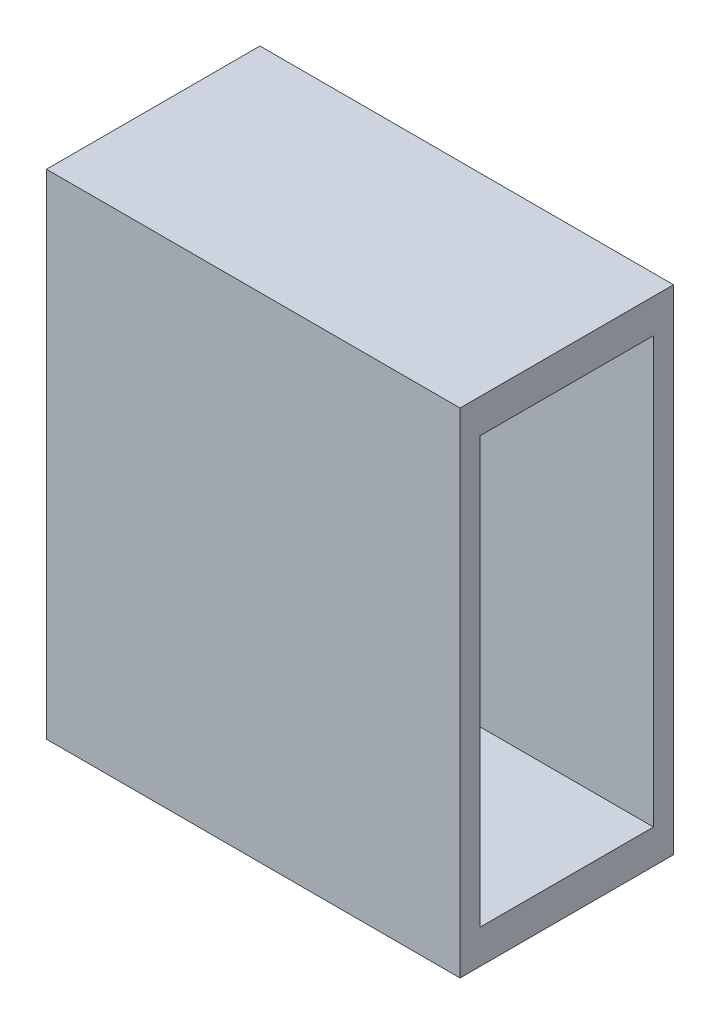
ISO-10303-21;
HEADER;
FILE_DESCRIPTION(('STEP AP214'),'2;1');
FILE_NAME('part.step','',(''),(''),'','','');
FILE_SCHEMA(('AUTOMOTIVE_DESIGN { 1 0 10303 214 1 1 1 1 }'));
ENDSEC;
DATA;
#1=APPLICATION_CONTEXT('core data for automotive mechanical design processes');
#2=APPLICATION_PROTOCOL_DEFINITION('international standard','automotive_design',2000,#1);
#3=PRODUCT_CONTEXT('',#1,'mechanical');
#4=PRODUCT('Part','Part','',(#3));
#5=PRODUCT_RELATED_PRODUCT_CATEGORY('part','',(#4));
#6=PRODUCT_DEFINITION_FORMATION('','',#4);
#7=PRODUCT_DEFINITION_CONTEXT('part definition',#1,'design');
#8=PRODUCT_DEFINITION('design','',#6,#7);
#9=PRODUCT_DEFINITION_SHAPE('','',#8);
#10=(LENGTH_UNIT() NAMED_UNIT(*) SI_UNIT(.MILLI.,.METRE.));
#11=(NAMED_UNIT(*) PLANE_ANGLE_UNIT() SI_UNIT($,.RADIAN.));
#12=(NAMED_UNIT(*) SI_UNIT($,.STERADIAN.) SOLID_ANGLE_UNIT());
#13=UNCERTAINTY_MEASURE_WITH_UNIT(LENGTH_MEASURE(1.E-05),#10,'distance_accuracy_value','');
#14=(GEOMETRIC_REPRESENTATION_CONTEXT(3) GLOBAL_UNCERTAINTY_ASSIGNED_CONTEXT((#13)) GLOBAL_UNIT_ASSIGNED_CONTEXT((#10,
#11,#12)) REPRESENTATION_CONTEXT('',''));
#15=CARTESIAN_POINT('',(0.,0.,0.));
#16=DIRECTION('',(0.,0.,1.));
#17=DIRECTION('',(1.,0.,0.));
#18=AXIS2_PLACEMENT_3D('',#15,#16,#17);
#19=CARTESIAN_POINT('',(26.,-37.,0.));
#20=DIRECTION('',(0.,1.,0.));
#21=DIRECTION('',(0.,0.,-1.));
#22=AXIS2_PLACEMENT_3D('',#19,#20,#21);
#23=PLANE('',#22);
#24=DIRECTION('',(-1.,0.,0.));
#25=VECTOR('',#24,1.);
#26=CARTESIAN_POINT('',(26.,-37.,-16.));
#27=LINE('',#26,#25);
#28=CARTESIAN_POINT('',(26.,-37.,-16.));
#29=VERTEX_POINT('',#28);
#30=CARTESIAN_POINT('',(-5.,-37.,-16.));
#31=VERTEX_POINT('',#30);
#32=EDGE_CURVE('E332',#29,#31,#27,.T.);
#33=ORIENTED_EDGE('',*,*,#32,.F.);
#34=DIRECTION('',(0.,0.,1.));
#35=VECTOR('',#34,1.);
#36=CARTESIAN_POINT('',(26.,-37.,0.));
#37=LINE('',#36,#35);
#38=CARTESIAN_POINT('',(26.,-37.,0.));
#39=VERTEX_POINT('',#38);
#40=EDGE_CURVE('E319',#29,#39,#37,.T.);
#41=ORIENTED_EDGE('',*,*,#40,.T.);
#42=DIRECTION('',(-1.,0.,0.));
#43=VECTOR('',#42,1.);
#44=CARTESIAN_POINT('',(26.,-37.,0.));
#45=LINE('',#44,#43);
#46=CARTESIAN_POINT('',(-5.,-37.,0.));
#47=VERTEX_POINT('',#46);
#48=EDGE_CURVE('E328',#39,#47,#45,.T.);
#49=ORIENTED_EDGE('',*,*,#48,.T.);
#50=DIRECTION('',(0.,0.,-1.));
#51=VECTOR('',#50,1.);
#52=CARTESIAN_POINT('',(-5.,-37.,-16.));
#53=LINE('',#52,#51);
#54=EDGE_CURVE('E237',#47,#31,#53,.T.);
#55=ORIENTED_EDGE('',*,*,#54,.T.);
#56=EDGE_LOOP('',(#33,#41,#49,#55));
#57=FACE_BOUND('',#56,.T.);
#58=DIRECTION('',(-0.99654575824488,0.,-0.08304547985374));
#59=VECTOR('',#58,1.);
#60=CARTESIAN_POINT('',(0.483965517241379,-37.,-5.80758620689655));
#61=LINE('',#60,#59);
#62=CARTESIAN_POINT('',(17.375,-37.,-4.4));
#63=VERTEX_POINT('',#62);
#64=CARTESIAN_POINT('',(2.375,-37.,-5.65));
#65=VERTEX_POINT('',#64);
#66=EDGE_CURVE('E217',#63,#65,#61,.T.);
#67=ORIENTED_EDGE('',*,*,#66,.F.);
#68=CARTESIAN_POINT('',(17.375,-37.,-8.));
#69=DIRECTION('',(0.,1.,0.));
#70=DIRECTION('',(0.,0.,1.));
#71=AXIS2_PLACEMENT_3D('',#68,#69,#70);
#72=CIRCLE('',#71,3.6);
#73=CARTESIAN_POINT('',(17.375,-37.,-11.6));
#74=VERTEX_POINT('',#73);
#75=EDGE_CURVE('E199',#63,#74,#72,.T.);
#76=ORIENTED_EDGE('',*,*,#75,.T.);
#77=DIRECTION('',(-0.99654575824488,0.,0.0830454798537401));
#78=VECTOR('',#77,1.);
#79=CARTESIAN_POINT('',(-0.840172413793104,-37.,-10.0820689655172));
#80=LINE('',#79,#78);
#81=CARTESIAN_POINT('',(2.375,-37.,-10.35));
#82=VERTEX_POINT('',#81);
#83=EDGE_CURVE('E209',#74,#82,#80,.T.);
#84=ORIENTED_EDGE('',*,*,#83,.T.);
#85=CARTESIAN_POINT('',(2.375,-37.,-8.));
#86=DIRECTION('',(0.,1.,0.));
#87=DIRECTION('',(0.,0.,1.));
#88=AXIS2_PLACEMENT_3D('',#85,#86,#87);
#89=CIRCLE('',#88,2.35);
#90=EDGE_CURVE('E206',#82,#65,#89,.T.);
#91=ORIENTED_EDGE('',*,*,#90,.T.);
#92=EDGE_LOOP('',(#67,#76,#84,#91));
#93=FACE_BOUND('',#92,.T.);
#94=ADVANCED_FACE('F45',(#57,#93),#23,.F.);
#95=CARTESIAN_POINT('',(0.,0.,0.));
#96=DIRECTION('',(1.,0.,0.));
#97=DIRECTION('',(0.,0.,1.));
#98=AXIS2_PLACEMENT_3D('',#95,#96,#97);
#99=PLANE('',#98);
#100=DIRECTION('',(0.,0.,1.));
#101=VECTOR('',#100,1.);
#102=CARTESIAN_POINT('',(0.,-30.25,0.));
#103=LINE('',#102,#101);
#104=CARTESIAN_POINT('',(0.,-30.25,-14.5));
#105=VERTEX_POINT('',#104);
#106=CARTESIAN_POINT('',(0.,-30.25,-1.5));
#107=VERTEX_POINT('',#106);
#108=EDGE_CURVE('E274',#105,#107,#103,.T.);
#109=ORIENTED_EDGE('',*,*,#108,.F.);
#110=DIRECTION('',(0.,1.,0.));
#111=VECTOR('',#110,1.);
#112=CARTESIAN_POINT('',(0.,-2.54999999999999,-14.5));
#113=LINE('',#112,#111);
#114=CARTESIAN_POINT('',(0.,-34.45,-14.5));
#115=VERTEX_POINT('',#114);
#116=EDGE_CURVE('E245',#115,#105,#113,.T.);
#117=ORIENTED_EDGE('',*,*,#116,.F.);
#118=DIRECTION('',(0.,0.,-1.));
#119=VECTOR('',#118,1.);
#120=CARTESIAN_POINT('',(0.,-34.45,-14.5));
#121=LINE('',#120,#119);
#122=CARTESIAN_POINT('',(0.,-34.45,-1.5));
#123=VERTEX_POINT('',#122);
#124=EDGE_CURVE('E256',#123,#115,#121,.T.);
#125=ORIENTED_EDGE('',*,*,#124,.F.);
#126=DIRECTION('',(0.,-1.,0.));
#127=VECTOR('',#126,1.);
#128=CARTESIAN_POINT('',(0.,-2.54999999999999,-1.5));
#129=LINE('',#128,#127);
#130=EDGE_CURVE('E11',#107,#123,#129,.T.);
#131=ORIENTED_EDGE('',*,*,#130,.F.);
#132=EDGE_LOOP('',(#109,#117,#125,#131));
#133=FACE_BOUND('',#132,.T.);
#134=ADVANCED_FACE('F375',(#133),#99,.F.);
#135=CARTESIAN_POINT('',(26.,0.,-1.5));
#136=DIRECTION('',(0.,0.,-1.));
#137=DIRECTION('',(1.,0.,0.));
#138=AXIS2_PLACEMENT_3D('',#135,#136,#137);
#139=PLANE('',#138);
#140=DIRECTION('',(-1.,0.,0.));
#141=VECTOR('',#140,1.);
#142=CARTESIAN_POINT('',(2.,-30.25,-1.5));
#143=LINE('',#142,#141);
#144=CARTESIAN_POINT('',(2.,-30.25,-1.5));
#145=VERTEX_POINT('',#144);
#146=EDGE_CURVE('E286',#145,#107,#143,.T.);
#147=ORIENTED_EDGE('',*,*,#146,.T.);
#148=ORIENTED_EDGE('',*,*,#130,.T.);
#149=DIRECTION('',(1.,0.,0.));
#150=VECTOR('',#149,1.);
#151=CARTESIAN_POINT('',(-3.5,-34.45,-1.5));
#152=LINE('',#151,#150);
#153=CARTESIAN_POINT('',(-3.5,-34.45,-1.5));
#154=VERTEX_POINT('',#153);
#155=EDGE_CURVE('E264',#154,#123,#152,.T.);
#156=ORIENTED_EDGE('',*,*,#155,.F.);
#157=DIRECTION('',(0.,-1.,0.));
#158=VECTOR('',#157,1.);
#159=CARTESIAN_POINT('',(-3.5,-2.54999999999999,-1.5));
#160=LINE('',#159,#158);
#161=CARTESIAN_POINT('',(-3.5,-2.54999999999999,-1.5));
#162=VERTEX_POINT('',#161);
#163=EDGE_CURVE('E244',#162,#154,#160,.T.);
#164=ORIENTED_EDGE('',*,*,#163,.F.);
#165=DIRECTION('',(1.,0.,0.));
#166=VECTOR('',#165,1.);
#167=CARTESIAN_POINT('',(-3.5,-2.54999999999999,-1.5));
#168=LINE('',#167,#166);
#169=CARTESIAN_POINT('',(0.,-2.54999999999999,-1.5));
#170=VERTEX_POINT('',#169);
#171=EDGE_CURVE('E266',#162,#170,#168,.T.);
#172=ORIENTED_EDGE('',*,*,#171,.T.);
#173=CARTESIAN_POINT('',(0.,-6.75,-1.5));
#174=VERTEX_POINT('',#173);
#175=EDGE_CURVE('E56',#170,#174,#129,.T.);
#176=ORIENTED_EDGE('',*,*,#175,.T.);
#177=DIRECTION('',(-1.,0.,0.));
#178=VECTOR('',#177,1.);
#179=CARTESIAN_POINT('',(2.,-6.75,-1.5));
#180=LINE('',#179,#178);
#181=CARTESIAN_POINT('',(2.,-6.75,-1.5));
#182=VERTEX_POINT('',#181);
#183=EDGE_CURVE('E299',#182,#174,#180,.T.);
#184=ORIENTED_EDGE('',*,*,#183,.F.);
#185=DIRECTION('',(0.,1.,0.));
#186=VECTOR('',#185,1.);
#187=CARTESIAN_POINT('',(2.,0.,-1.5));
#188=LINE('',#187,#186);
#189=CARTESIAN_POINT('',(2.00000000000001,-2.54999999999999,-1.5));
#190=VERTEX_POINT('',#189);
#191=EDGE_CURVE('E289',#182,#190,#188,.T.);
#192=ORIENTED_EDGE('',*,*,#191,.T.);
#193=DIRECTION('',(-1.,0.,0.));
#194=VECTOR('',#193,1.);
#195=CARTESIAN_POINT('',(26.,-2.54999999999999,-1.5));
#196=LINE('',#195,#194);
#197=CARTESIAN_POINT('',(26.,-2.54999999999999,-1.5));
#198=VERTEX_POINT('',#197);
#199=EDGE_CURVE('E329',#198,#190,#196,.T.);
#200=ORIENTED_EDGE('',*,*,#199,.F.);
#201=DIRECTION('',(0.,1.,0.));
#202=VECTOR('',#201,1.);
#203=CARTESIAN_POINT('',(26.,0.,-1.5));
#204=LINE('',#203,#202);
#205=CARTESIAN_POINT('',(26.,-34.45,-1.5));
#206=VERTEX_POINT('',#205);
#207=EDGE_CURVE('E306',#206,#198,#204,.T.);
#208=ORIENTED_EDGE('',*,*,#207,.F.);
#209=DIRECTION('',(-1.,0.,0.));
#210=VECTOR('',#209,1.);
#211=CARTESIAN_POINT('',(26.,-34.45,-1.5));
#212=LINE('',#211,#210);
#213=CARTESIAN_POINT('',(2.,-34.45,-1.5));
#214=VERTEX_POINT('',#213);
#215=EDGE_CURVE('E343',#206,#214,#212,.T.);
#216=ORIENTED_EDGE('',*,*,#215,.T.);
#217=DIRECTION('',(0.,1.,0.));
#218=VECTOR('',#217,1.);
#219=CARTESIAN_POINT('',(2.,0.,-1.5));
#220=LINE('',#219,#218);
#221=EDGE_CURVE('E276',#214,#145,#220,.T.);
#222=ORIENTED_EDGE('',*,*,#221,.T.);
#223=EDGE_LOOP('',(#147,#148,#156,#164,#172,#176,#184,#192,#200,#208,#216,#222));
#224=FACE_BOUND('',#223,.T.);
#225=ADVANCED_FACE('F381',(#224),#139,.T.);
#226=CARTESIAN_POINT('',(26.,0.,-14.5));
#227=DIRECTION('',(0.,0.,-1.));
#228=DIRECTION('',(1.,0.,0.));
#229=AXIS2_PLACEMENT_3D('',#226,#227,#228);
#230=PLANE('',#229);
#231=DIRECTION('',(0.,1.,0.));
#232=VECTOR('',#231,1.);
#233=CARTESIAN_POINT('',(2.,0.,-14.5));
#234=LINE('',#233,#232);
#235=CARTESIAN_POINT('',(2.,-34.45,-14.5));
#236=VERTEX_POINT('',#235);
#237=CARTESIAN_POINT('',(2.,-30.25,-14.5));
#238=VERTEX_POINT('',#237);
#239=EDGE_CURVE('E270',#236,#238,#234,.T.);
#240=ORIENTED_EDGE('',*,*,#239,.F.);
#241=DIRECTION('',(-1.,0.,0.));
#242=VECTOR('',#241,1.);
#243=CARTESIAN_POINT('',(26.,-34.45,-14.5));
#244=LINE('',#243,#242);
#245=CARTESIAN_POINT('',(26.,-34.45,-14.5));
#246=VERTEX_POINT('',#245);
#247=EDGE_CURVE('E340',#246,#236,#244,.T.);
#248=ORIENTED_EDGE('',*,*,#247,.F.);
#249=DIRECTION('',(0.,1.,0.));
#250=VECTOR('',#249,1.);
#251=CARTESIAN_POINT('',(26.,0.,-14.5));
#252=LINE('',#251,#250);
#253=CARTESIAN_POINT('',(26.,-2.54999999999999,-14.5));
#254=VERTEX_POINT('',#253);
#255=EDGE_CURVE('E311',#246,#254,#252,.T.);
#256=ORIENTED_EDGE('',*,*,#255,.T.);
#257=DIRECTION('',(-1.,0.,0.));
#258=VECTOR('',#257,1.);
#259=CARTESIAN_POINT('',(26.,-2.54999999999999,-14.5));
#260=LINE('',#259,#258);
#261=CARTESIAN_POINT('',(2.00000000000001,-2.54999999999999,-14.5));
#262=VERTEX_POINT('',#261);
#263=EDGE_CURVE('E324',#254,#262,#260,.T.);
#264=ORIENTED_EDGE('',*,*,#263,.T.);
#265=DIRECTION('',(0.,1.,0.));
#266=VECTOR('',#265,1.);
#267=CARTESIAN_POINT('',(2.,0.,-14.5));
#268=LINE('',#267,#266);
#269=CARTESIAN_POINT('',(2.,-6.75,-14.5));
#270=VERTEX_POINT('',#269);
#271=EDGE_CURVE('E294',#270,#262,#268,.T.);
#272=ORIENTED_EDGE('',*,*,#271,.F.);
#273=DIRECTION('',(-1.,0.,0.));
#274=VECTOR('',#273,1.);
#275=CARTESIAN_POINT('',(2.,-6.75,-14.5));
#276=LINE('',#275,#274);
#277=CARTESIAN_POINT('',(0.,-6.75,-14.5));
#278=VERTEX_POINT('',#277);
#279=EDGE_CURVE('E284',#270,#278,#276,.T.);
#280=ORIENTED_EDGE('',*,*,#279,.T.);
#281=CARTESIAN_POINT('',(0.,-2.54999999999999,-14.5));
#282=VERTEX_POINT('',#281);
#283=EDGE_CURVE('E54',#278,#282,#113,.T.);
#284=ORIENTED_EDGE('',*,*,#283,.T.);
#285=DIRECTION('',(1.,0.,0.));
#286=VECTOR('',#285,1.);
#287=CARTESIAN_POINT('',(-3.5,-2.54999999999999,-14.5));
#288=LINE('',#287,#286);
#289=CARTESIAN_POINT('',(-3.5,-2.54999999999999,-14.5));
#290=VERTEX_POINT('',#289);
#291=EDGE_CURVE('E253',#290,#282,#288,.T.);
#292=ORIENTED_EDGE('',*,*,#291,.F.);
#293=DIRECTION('',(0.,1.,0.));
#294=VECTOR('',#293,1.);
#295=CARTESIAN_POINT('',(-3.5,-2.54999999999999,-14.5));
#296=LINE('',#295,#294);
#297=CARTESIAN_POINT('',(-3.5,-34.45,-14.5));
#298=VERTEX_POINT('',#297);
#299=EDGE_CURVE('E250',#298,#290,#296,.T.);
#300=ORIENTED_EDGE('',*,*,#299,.F.);
#301=DIRECTION('',(1.,0.,0.));
#302=VECTOR('',#301,1.);
#303=CARTESIAN_POINT('',(-3.5,-34.45,-14.5));
#304=LINE('',#303,#302);
#305=EDGE_CURVE('E262',#298,#115,#304,.T.);
#306=ORIENTED_EDGE('',*,*,#305,.T.);
#307=ORIENTED_EDGE('',*,*,#116,.T.);
#308=DIRECTION('',(-1.,0.,0.));
#309=VECTOR('',#308,1.);
#310=CARTESIAN_POINT('',(2.,-30.25,-14.5));
#311=LINE('',#310,#309);
#312=EDGE_CURVE('E281',#238,#105,#311,.T.);
#313=ORIENTED_EDGE('',*,*,#312,.F.);
#314=EDGE_LOOP('',(#240,#248,#256,#264,#272,#280,#284,#292,#300,#306,#307,#313));
#315=FACE_BOUND('',#314,.T.);
#316=ADVANCED_FACE('F397',(#315),#230,.F.);
#317=CARTESIAN_POINT('',(26.,0.,0.));
#318=DIRECTION('',(0.,1.,0.));
#319=DIRECTION('',(0.,0.,-1.));
#320=AXIS2_PLACEMENT_3D('',#317,#318,#319);
#321=PLANE('',#320);
#322=DIRECTION('',(-1.,0.,0.));
#323=VECTOR('',#322,1.);
#324=CARTESIAN_POINT('',(26.,0.,0.));
#325=LINE('',#324,#323);
#326=CARTESIAN_POINT('',(26.,0.,0.));
#327=VERTEX_POINT('',#326);
#328=CARTESIAN_POINT('',(-5.,0.,0.));
#329=VERTEX_POINT('',#328);
#330=EDGE_CURVE('E325',#327,#329,#325,.T.);
#331=ORIENTED_EDGE('',*,*,#330,.F.);
#332=DIRECTION('',(0.,0.,1.));
#333=VECTOR('',#332,1.);
#334=CARTESIAN_POINT('',(26.,0.,0.));
#335=LINE('',#334,#333);
#336=CARTESIAN_POINT('',(26.,0.,-16.));
#337=VERTEX_POINT('',#336);
#338=EDGE_CURVE('E314',#337,#327,#335,.T.);
#339=ORIENTED_EDGE('',*,*,#338,.F.);
#340=DIRECTION('',(-1.,0.,0.));
#341=VECTOR('',#340,1.);
#342=CARTESIAN_POINT('',(26.,0.,-16.));
#343=LINE('',#342,#341);
#344=CARTESIAN_POINT('',(-5.,0.,-16.));
#345=VERTEX_POINT('',#344);
#346=EDGE_CURVE('E335',#337,#345,#343,.T.);
#347=ORIENTED_EDGE('',*,*,#346,.T.);
#348=DIRECTION('',(0.,0.,1.));
#349=VECTOR('',#348,1.);
#350=CARTESIAN_POINT('',(-5.,0.,-16.));
#351=LINE('',#350,#349);
#352=EDGE_CURVE('E230',#345,#329,#351,.T.);
#353=ORIENTED_EDGE('',*,*,#352,.T.);
#354=EDGE_LOOP('',(#331,#339,#347,#353));
#355=FACE_BOUND('',#354,.T.);
#356=ADVANCED_FACE('F393',(#355),#321,.T.);
#357=CARTESIAN_POINT('',(26.,0.,-16.));
#358=DIRECTION('',(0.,0.,-1.));
#359=DIRECTION('',(0.,-1.,0.));
#360=AXIS2_PLACEMENT_3D('',#357,#358,#359);
#361=PLANE('',#360);
#362=ORIENTED_EDGE('',*,*,#346,.F.);
#363=DIRECTION('',(0.,1.,0.));
#364=VECTOR('',#363,1.);
#365=CARTESIAN_POINT('',(26.,0.,-16.));
#366=LINE('',#365,#364);
#367=EDGE_CURVE('E317',#29,#337,#366,.T.);
#368=ORIENTED_EDGE('',*,*,#367,.F.);
#369=ORIENTED_EDGE('',*,*,#32,.T.);
#370=DIRECTION('',(0.,1.,0.));
#371=VECTOR('',#370,1.);
#372=CARTESIAN_POINT('',(-5.,0.,-16.));
#373=LINE('',#372,#371);
#374=EDGE_CURVE('E240',#31,#345,#373,.T.);
#375=ORIENTED_EDGE('',*,*,#374,.T.);
#376=EDGE_LOOP('',(#362,#368,#369,#375));
#377=FACE_BOUND('',#376,.T.);
#378=ADVANCED_FACE('F390',(#377),#361,.T.);
#379=CARTESIAN_POINT('',(26.,-2.54999999999999,0.));
#380=DIRECTION('',(0.,-1.,0.));
#381=DIRECTION('',(0.,0.,1.));
#382=AXIS2_PLACEMENT_3D('',#379,#380,#381);
#383=PLANE('',#382);
#384=DIRECTION('',(0.,0.,-1.));
#385=VECTOR('',#384,1.);
#386=CARTESIAN_POINT('',(2.,-2.54999999999999,0.));
#387=LINE('',#386,#385);
#388=EDGE_CURVE('E292',#190,#262,#387,.T.);
#389=ORIENTED_EDGE('',*,*,#388,.T.);
#390=ORIENTED_EDGE('',*,*,#263,.F.);
#391=DIRECTION('',(0.,0.,-1.));
#392=VECTOR('',#391,1.);
#393=CARTESIAN_POINT('',(26.,-2.54999999999999,0.));
#394=LINE('',#393,#392);
#395=EDGE_CURVE('E288',#198,#254,#394,.T.);
#396=ORIENTED_EDGE('',*,*,#395,.F.);
#397=ORIENTED_EDGE('',*,*,#199,.T.);
#398=EDGE_LOOP('',(#389,#390,#396,#397));
#399=FACE_BOUND('',#398,.T.);
#400=ADVANCED_FACE('F47',(#399),#383,.T.);
#401=CARTESIAN_POINT('',(26.,-34.45,0.));
#402=DIRECTION('',(0.,-1.,0.));
#403=DIRECTION('',(0.,0.,1.));
#404=AXIS2_PLACEMENT_3D('',#401,#402,#403);
#405=PLANE('',#404);
#406=ORIENTED_EDGE('',*,*,#215,.F.);
#407=DIRECTION('',(0.,0.,-1.));
#408=VECTOR('',#407,1.);
#409=CARTESIAN_POINT('',(26.,-34.45,0.));
#410=LINE('',#409,#408);
#411=EDGE_CURVE('E309',#206,#246,#410,.T.);
#412=ORIENTED_EDGE('',*,*,#411,.T.);
#413=ORIENTED_EDGE('',*,*,#247,.T.);
#414=DIRECTION('',(0.,0.,-1.));
#415=VECTOR('',#414,1.);
#416=CARTESIAN_POINT('',(2.,-34.45,0.));
#417=LINE('',#416,#415);
#418=EDGE_CURVE('E273',#214,#236,#417,.T.);
#419=ORIENTED_EDGE('',*,*,#418,.F.);
#420=EDGE_LOOP('',(#406,#412,#413,#419));
#421=FACE_BOUND('',#420,.T.);
#422=ADVANCED_FACE('F402',(#421),#405,.F.);
#423=CARTESIAN_POINT('',(26.,0.,0.));
#424=DIRECTION('',(0.,0.,-1.));
#425=DIRECTION('',(1.,0.,0.));
#426=AXIS2_PLACEMENT_3D('',#423,#424,#425);
#427=PLANE('',#426);
#428=ORIENTED_EDGE('',*,*,#48,.F.);
#429=DIRECTION('',(0.,1.,0.));
#430=VECTOR('',#429,1.);
#431=CARTESIAN_POINT('',(26.,0.,0.));
#432=LINE('',#431,#430);
#433=EDGE_CURVE('E322',#39,#327,#432,.T.);
#434=ORIENTED_EDGE('',*,*,#433,.T.);
#435=ORIENTED_EDGE('',*,*,#330,.T.);
#436=DIRECTION('',(0.,-1.,0.));
#437=VECTOR('',#436,1.);
#438=CARTESIAN_POINT('',(-5.,0.,0.));
#439=LINE('',#438,#437);
#440=EDGE_CURVE('E235',#329,#47,#439,.T.);
#441=ORIENTED_EDGE('',*,*,#440,.T.);
#442=EDGE_LOOP('',(#428,#434,#435,#441));
#443=FACE_BOUND('',#442,.T.);
#444=ADVANCED_FACE('F389',(#443),#427,.F.);
#445=CARTESIAN_POINT('',(26.,0.,0.));
#446=DIRECTION('',(1.,0.,0.));
#447=DIRECTION('',(0.,0.,1.));
#448=AXIS2_PLACEMENT_3D('',#445,#446,#447);
#449=PLANE('',#448);
#450=ORIENTED_EDGE('',*,*,#395,.T.);
#451=ORIENTED_EDGE('',*,*,#255,.F.);
#452=ORIENTED_EDGE('',*,*,#411,.F.);
#453=ORIENTED_EDGE('',*,*,#207,.T.);
#454=EDGE_LOOP('',(#450,#451,#452,#453));
#455=FACE_BOUND('',#454,.T.);
#456=ORIENTED_EDGE('',*,*,#338,.T.);
#457=ORIENTED_EDGE('',*,*,#433,.F.);
#458=ORIENTED_EDGE('',*,*,#40,.F.);
#459=ORIENTED_EDGE('',*,*,#367,.T.);
#460=EDGE_LOOP('',(#456,#457,#458,#459));
#461=FACE_BOUND('',#460,.T.);
#462=ADVANCED_FACE('F447',(#455,#461),#449,.T.);
#463=DIRECTION('',(0.,0.,1.));
#464=VECTOR('',#463,1.);
#465=CARTESIAN_POINT('',(0.,-2.54999999999999,-14.5));
#466=LINE('',#465,#464);
#467=EDGE_CURVE('E71',#282,#170,#466,.T.);
#468=ORIENTED_EDGE('',*,*,#467,.F.);
#469=ORIENTED_EDGE('',*,*,#283,.F.);
#470=DIRECTION('',(0.,0.,1.));
#471=VECTOR('',#470,1.);
#472=CARTESIAN_POINT('',(0.,-6.75,0.));
#473=LINE('',#472,#471);
#474=EDGE_CURVE('E269',#278,#174,#473,.T.);
#475=ORIENTED_EDGE('',*,*,#474,.T.);
#476=ORIENTED_EDGE('',*,*,#175,.F.);
#477=EDGE_LOOP('',(#468,#469,#475,#476));
#478=FACE_BOUND('',#477,.T.);
#479=ADVANCED_FACE('F384',(#478),#99,.F.);
#480=CARTESIAN_POINT('',(2.,-6.75,0.));
#481=DIRECTION('',(0.,1.,0.));
#482=DIRECTION('',(0.,0.,-1.));
#483=AXIS2_PLACEMENT_3D('',#480,#481,#482);
#484=PLANE('',#483);
#485=ORIENTED_EDGE('',*,*,#474,.F.);
#486=ORIENTED_EDGE('',*,*,#279,.F.);
#487=DIRECTION('',(0.,0.,1.));
#488=VECTOR('',#487,1.);
#489=CARTESIAN_POINT('',(2.,-6.75,0.));
#490=LINE('',#489,#488);
#491=EDGE_CURVE('E297',#270,#182,#490,.T.);
#492=ORIENTED_EDGE('',*,*,#491,.T.);
#493=ORIENTED_EDGE('',*,*,#183,.T.);
#494=EDGE_LOOP('',(#485,#486,#492,#493));
#495=FACE_BOUND('',#494,.T.);
#496=ADVANCED_FACE('F437',(#495),#484,.F.);
#497=CARTESIAN_POINT('',(2.,0.,0.));
#498=DIRECTION('',(1.,0.,0.));
#499=DIRECTION('',(0.,0.,1.));
#500=AXIS2_PLACEMENT_3D('',#497,#498,#499);
#501=PLANE('',#500);
#502=ORIENTED_EDGE('',*,*,#191,.F.);
#503=ORIENTED_EDGE('',*,*,#491,.F.);
#504=ORIENTED_EDGE('',*,*,#271,.T.);
#505=ORIENTED_EDGE('',*,*,#388,.F.);
#506=EDGE_LOOP('',(#502,#503,#504,#505));
#507=FACE_BOUND('',#506,.T.);
#508=ADVANCED_FACE('F441',(#507),#501,.T.);
#509=CARTESIAN_POINT('',(2.,-30.25,0.));
#510=DIRECTION('',(0.,1.,0.));
#511=DIRECTION('',(0.,0.,-1.));
#512=AXIS2_PLACEMENT_3D('',#509,#510,#511);
#513=PLANE('',#512);
#514=ORIENTED_EDGE('',*,*,#108,.T.);
#515=ORIENTED_EDGE('',*,*,#146,.F.);
#516=DIRECTION('',(0.,0.,1.));
#517=VECTOR('',#516,1.);
#518=CARTESIAN_POINT('',(2.,-30.25,0.));
#519=LINE('',#518,#517);
#520=EDGE_CURVE('E279',#238,#145,#519,.T.);
#521=ORIENTED_EDGE('',*,*,#520,.F.);
#522=ORIENTED_EDGE('',*,*,#312,.T.);
#523=EDGE_LOOP('',(#514,#515,#521,#522));
#524=FACE_BOUND('',#523,.T.);
#525=ADVANCED_FACE('F417',(#524),#513,.T.);
#526=CARTESIAN_POINT('',(2.,0.,0.));
#527=DIRECTION('',(1.,0.,0.));
#528=DIRECTION('',(0.,0.,1.));
#529=AXIS2_PLACEMENT_3D('',#526,#527,#528);
#530=PLANE('',#529);
#531=ORIENTED_EDGE('',*,*,#239,.T.);
#532=ORIENTED_EDGE('',*,*,#520,.T.);
#533=ORIENTED_EDGE('',*,*,#221,.F.);
#534=ORIENTED_EDGE('',*,*,#418,.T.);
#535=EDGE_LOOP('',(#531,#532,#533,#534));
#536=FACE_BOUND('',#535,.T.);
#537=ADVANCED_FACE('F452',(#536),#530,.T.);
#538=CARTESIAN_POINT('',(-3.5,-2.54999999999999,-14.5));
#539=DIRECTION('',(0.,-1.,0.));
#540=DIRECTION('',(0.,0.,1.));
#541=AXIS2_PLACEMENT_3D('',#538,#539,#540);
#542=PLANE('',#541);
#543=ORIENTED_EDGE('',*,*,#467,.T.);
#544=ORIENTED_EDGE('',*,*,#171,.F.);
#545=DIRECTION('',(0.,0.,1.));
#546=VECTOR('',#545,1.);
#547=CARTESIAN_POINT('',(-3.5,-2.54999999999999,-14.5));
#548=LINE('',#547,#546);
#549=EDGE_CURVE('E242',#290,#162,#548,.T.);
#550=ORIENTED_EDGE('',*,*,#549,.F.);
#551=ORIENTED_EDGE('',*,*,#291,.T.);
#552=EDGE_LOOP('',(#543,#544,#550,#551));
#553=FACE_BOUND('',#552,.T.);
#554=ADVANCED_FACE('F431',(#553),#542,.T.);
#555=CARTESIAN_POINT('',(-3.5,-34.45,-14.5));
#556=DIRECTION('',(0.,1.,0.));
#557=DIRECTION('',(0.,0.,-1.));
#558=AXIS2_PLACEMENT_3D('',#555,#556,#557);
#559=PLANE('',#558);
#560=ORIENTED_EDGE('',*,*,#124,.T.);
#561=ORIENTED_EDGE('',*,*,#305,.F.);
#562=DIRECTION('',(0.,0.,-1.));
#563=VECTOR('',#562,1.);
#564=CARTESIAN_POINT('',(-3.5,-34.45,-14.5));
#565=LINE('',#564,#563);
#566=EDGE_CURVE('E248',#154,#298,#565,.T.);
#567=ORIENTED_EDGE('',*,*,#566,.F.);
#568=ORIENTED_EDGE('',*,*,#155,.T.);
#569=EDGE_LOOP('',(#560,#561,#567,#568));
#570=FACE_BOUND('',#569,.T.);
#571=ADVANCED_FACE('F424',(#570),#559,.T.);
#572=CARTESIAN_POINT('',(-5.,0.,0.));
#573=DIRECTION('',(-1.,0.,0.));
#574=DIRECTION('',(0.,0.,-1.));
#575=AXIS2_PLACEMENT_3D('',#572,#573,#574);
#576=PLANE('',#575);
#577=ORIENTED_EDGE('',*,*,#352,.F.);
#578=ORIENTED_EDGE('',*,*,#374,.F.);
#579=ORIENTED_EDGE('',*,*,#54,.F.);
#580=ORIENTED_EDGE('',*,*,#440,.F.);
#581=EDGE_LOOP('',(#577,#578,#579,#580));
#582=FACE_BOUND('',#581,.T.);
#583=CARTESIAN_POINT('',(-5.,-23.25,-8.));
#584=DIRECTION('',(1.,0.,0.));
#585=DIRECTION('',(0.,0.,-1.));
#586=AXIS2_PLACEMENT_3D('',#583,#584,#585);
#587=CIRCLE('',#586,5.2);
#588=CARTESIAN_POINT('',(-5.,-23.25,-13.2));
#589=VERTEX_POINT('',#588);
#590=EDGE_CURVE('E227',#589,#589,#587,.T.);
#591=ORIENTED_EDGE('',*,*,#590,.T.);
#592=EDGE_LOOP('',(#591));
#593=FACE_BOUND('',#592,.T.);
#594=ADVANCED_FACE('F509',(#582,#593),#576,.T.);
#595=CARTESIAN_POINT('',(-3.5,0.,0.));
#596=DIRECTION('',(-1.,0.,0.));
#597=DIRECTION('',(0.,0.,-1.));
#598=AXIS2_PLACEMENT_3D('',#595,#596,#597);
#599=PLANE('',#598);
#600=ORIENTED_EDGE('',*,*,#163,.T.);
#601=ORIENTED_EDGE('',*,*,#566,.T.);
#602=ORIENTED_EDGE('',*,*,#299,.T.);
#603=ORIENTED_EDGE('',*,*,#549,.T.);
#604=EDGE_LOOP('',(#600,#601,#602,#603));
#605=FACE_BOUND('',#604,.T.);
#606=CARTESIAN_POINT('',(-3.5,-23.25,-8.));
#607=DIRECTION('',(1.,0.,0.));
#608=DIRECTION('',(0.,0.,-1.));
#609=AXIS2_PLACEMENT_3D('',#606,#607,#608);
#610=CIRCLE('',#609,5.2);
#611=CARTESIAN_POINT('',(-3.5,-23.25,-13.2));
#612=VERTEX_POINT('',#611);
#613=EDGE_CURVE('E223',#612,#612,#610,.T.);
#614=ORIENTED_EDGE('',*,*,#613,.F.);
#615=EDGE_LOOP('',(#614));
#616=FACE_BOUND('',#615,.T.);
#617=ADVANCED_FACE('F428',(#605,#616),#599,.F.);
#618=CARTESIAN_POINT('',(-5.,-23.25,-8.));
#619=DIRECTION('',(1.,0.,0.));
#620=DIRECTION('',(0.,0.,1.));
#621=AXIS2_PLACEMENT_3D('',#618,#619,#620);
#622=CYLINDRICAL_SURFACE('',#621,5.2);
#623=ORIENTED_EDGE('',*,*,#590,.F.);
#624=EDGE_LOOP('',(#623));
#625=FACE_BOUND('',#624,.T.);
#626=ORIENTED_EDGE('',*,*,#613,.T.);
#627=EDGE_LOOP('',(#626));
#628=FACE_BOUND('',#627,.T.);
#629=ADVANCED_FACE('F527',(#625,#628),#622,.F.);
#630=CARTESIAN_POINT('',(0.483965517241379,-35.5,-5.80758620689655));
#631=DIRECTION('',(0.08304547985374,0.,-0.996545758244879));
#632=DIRECTION('',(0.99654575824488,0.,0.08304547985374));
#633=AXIS2_PLACEMENT_3D('',#630,#631,#632);
#634=PLANE('',#633);
#635=ORIENTED_EDGE('',*,*,#66,.T.);
#636=DIRECTION('',(0.,-1.,0.));
#637=VECTOR('',#636,1.);
#638=CARTESIAN_POINT('',(2.375,-35.5,-5.65));
#639=LINE('',#638,#637);
#640=CARTESIAN_POINT('',(2.375,-35.5,-5.65));
#641=VERTEX_POINT('',#640);
#642=EDGE_CURVE('E205',#641,#65,#639,.T.);
#643=ORIENTED_EDGE('',*,*,#642,.F.);
#644=DIRECTION('',(-0.99654575824488,0.,-0.08304547985374));
#645=VECTOR('',#644,1.);
#646=CARTESIAN_POINT('',(0.483965517241379,-35.5,-5.80758620689655));
#647=LINE('',#646,#645);
#648=CARTESIAN_POINT('',(17.375,-35.5,-4.4));
#649=VERTEX_POINT('',#648);
#650=EDGE_CURVE('E191',#649,#641,#647,.T.);
#651=ORIENTED_EDGE('',*,*,#650,.F.);
#652=DIRECTION('',(0.,-1.,0.));
#653=VECTOR('',#652,1.);
#654=CARTESIAN_POINT('',(17.375,-35.5,-4.4));
#655=LINE('',#654,#653);
#656=EDGE_CURVE('E63',#649,#63,#655,.T.);
#657=ORIENTED_EDGE('',*,*,#656,.T.);
#658=EDGE_LOOP('',(#635,#643,#651,#657));
#659=FACE_BOUND('',#658,.T.);
#660=ADVANCED_FACE('F204',(#659),#634,.T.);
#661=CARTESIAN_POINT('',(2.375,-35.5,-8.));
#662=DIRECTION('',(0.,-1.,0.));
#663=DIRECTION('',(0.,0.,1.));
#664=AXIS2_PLACEMENT_3D('',#661,#662,#663);
#665=CYLINDRICAL_SURFACE('',#664,2.35);
#666=ORIENTED_EDGE('',*,*,#90,.F.);
#667=DIRECTION('',(0.,-1.,0.));
#668=VECTOR('',#667,1.);
#669=CARTESIAN_POINT('',(2.375,-35.5,-10.35));
#670=LINE('',#669,#668);
#671=CARTESIAN_POINT('',(2.375,-35.5,-10.35));
#672=VERTEX_POINT('',#671);
#673=EDGE_CURVE('E224',#672,#82,#670,.T.);
#674=ORIENTED_EDGE('',*,*,#673,.F.);
#675=CARTESIAN_POINT('',(2.375,-35.5,-8.));
#676=DIRECTION('',(0.,1.,0.));
#677=DIRECTION('',(0.,0.,1.));
#678=AXIS2_PLACEMENT_3D('',#675,#676,#677);
#679=CIRCLE('',#678,2.35);
#680=EDGE_CURVE('E202',#672,#641,#679,.T.);
#681=ORIENTED_EDGE('',*,*,#680,.T.);
#682=ORIENTED_EDGE('',*,*,#642,.T.);
#683=EDGE_LOOP('',(#666,#674,#681,#682));
#684=FACE_BOUND('',#683,.T.);
#685=ADVANCED_FACE('F545',(#684),#665,.F.);
#686=CARTESIAN_POINT('',(-0.840172413793104,-35.5,-10.0820689655172));
#687=DIRECTION('',(-0.08304547985374,0.,-0.996545758244879));
#688=DIRECTION('',(0.99654575824488,0.,-0.0830454798537401));
#689=AXIS2_PLACEMENT_3D('',#686,#687,#688);
#690=PLANE('',#689);
#691=ORIENTED_EDGE('',*,*,#83,.F.);
#692=DIRECTION('',(0.,-1.,0.));
#693=VECTOR('',#692,1.);
#694=CARTESIAN_POINT('',(17.375,-35.5,-11.6));
#695=LINE('',#694,#693);
#696=CARTESIAN_POINT('',(17.375,-35.5,-11.6));
#697=VERTEX_POINT('',#696);
#698=EDGE_CURVE('E201',#697,#74,#695,.T.);
#699=ORIENTED_EDGE('',*,*,#698,.F.);
#700=DIRECTION('',(-0.99654575824488,0.,0.0830454798537401));
#701=VECTOR('',#700,1.);
#702=CARTESIAN_POINT('',(-0.840172413793104,-35.5,-10.0820689655172));
#703=LINE('',#702,#701);
#704=EDGE_CURVE('E193',#697,#672,#703,.T.);
#705=ORIENTED_EDGE('',*,*,#704,.T.);
#706=ORIENTED_EDGE('',*,*,#673,.T.);
#707=EDGE_LOOP('',(#691,#699,#705,#706));
#708=FACE_BOUND('',#707,.T.);
#709=ADVANCED_FACE('F554',(#708),#690,.F.);
#710=CARTESIAN_POINT('',(17.375,-35.5,-8.));
#711=DIRECTION('',(0.,-1.,0.));
#712=DIRECTION('',(0.,0.,1.));
#713=AXIS2_PLACEMENT_3D('',#710,#711,#712);
#714=CYLINDRICAL_SURFACE('',#713,3.6);
#715=ORIENTED_EDGE('',*,*,#75,.F.);
#716=ORIENTED_EDGE('',*,*,#656,.F.);
#717=CARTESIAN_POINT('',(17.375,-35.5,-8.));
#718=DIRECTION('',(0.,1.,0.));
#719=DIRECTION('',(0.,0.,1.));
#720=AXIS2_PLACEMENT_3D('',#717,#718,#719);
#721=CIRCLE('',#720,3.6);
#722=EDGE_CURVE('E188',#649,#697,#721,.T.);
#723=ORIENTED_EDGE('',*,*,#722,.T.);
#724=ORIENTED_EDGE('',*,*,#698,.T.);
#725=EDGE_LOOP('',(#715,#716,#723,#724));
#726=FACE_BOUND('',#725,.T.);
#727=ADVANCED_FACE('F197',(#726),#714,.F.);
#728=CARTESIAN_POINT('',(0.,-35.5,0.));
#729=DIRECTION('',(0.,-1.,0.));
#730=DIRECTION('',(0.,0.,1.));
#731=AXIS2_PLACEMENT_3D('',#728,#729,#730);
#732=PLANE('',#731);
#733=CARTESIAN_POINT('',(2.375,-35.5,-8.));
#734=DIRECTION('',(0.,1.,0.));
#735=DIRECTION('',(0.,0.,1.));
#736=AXIS2_PLACEMENT_3D('',#733,#734,#735);
#737=CIRCLE('',#736,0.150000000000003);
#738=CARTESIAN_POINT('',(2.375,-35.5,-7.85));
#739=VERTEX_POINT('',#738);
#740=EDGE_CURVE('E49',#739,#739,#737,.T.);
#741=ORIENTED_EDGE('',*,*,#740,.T.);
#742=EDGE_LOOP('',(#741));
#743=FACE_BOUND('',#742,.T.);
#744=CARTESIAN_POINT('',(17.375,-35.5,-8.));
#745=DIRECTION('',(0.,1.,0.));
#746=DIRECTION('',(0.,0.,1.));
#747=AXIS2_PLACEMENT_3D('',#744,#745,#746);
#748=CIRCLE('',#747,0.150000000000002);
#749=CARTESIAN_POINT('',(17.375,-35.5,-7.85));
#750=VERTEX_POINT('',#749);
#751=EDGE_CURVE('E347',#750,#750,#748,.T.);
#752=ORIENTED_EDGE('',*,*,#751,.T.);
#753=EDGE_LOOP('',(#752));
#754=FACE_BOUND('',#753,.T.);
#755=ORIENTED_EDGE('',*,*,#650,.T.);
#756=ORIENTED_EDGE('',*,*,#680,.F.);
#757=ORIENTED_EDGE('',*,*,#704,.F.);
#758=ORIENTED_EDGE('',*,*,#722,.F.);
#759=EDGE_LOOP('',(#755,#756,#757,#758));
#760=FACE_BOUND('',#759,.T.);
#761=ADVANCED_FACE('F189',(#743,#754,#760),#732,.T.);
#762=CARTESIAN_POINT('',(17.375,-35.,-8.));
#763=DIRECTION('',(0.,-1.,0.));
#764=DIRECTION('',(0.,0.,1.));
#765=AXIS2_PLACEMENT_3D('',#762,#763,#764);
#766=CYLINDRICAL_SURFACE('',#765,0.150000000000002);
#767=ORIENTED_EDGE('',*,*,#751,.F.);
#768=EDGE_LOOP('',(#767));
#769=FACE_BOUND('',#768,.T.);
#770=CARTESIAN_POINT('',(17.375,-35.,-8.));
#771=DIRECTION('',(0.,1.,0.));
#772=DIRECTION('',(0.,0.,1.));
#773=AXIS2_PLACEMENT_3D('',#770,#771,#772);
#774=CIRCLE('',#773,0.150000000000002);
#775=CARTESIAN_POINT('',(17.375,-35.,-7.85));
#776=VERTEX_POINT('',#775);
#777=EDGE_CURVE('E212',#776,#776,#774,.T.);
#778=ORIENTED_EDGE('',*,*,#777,.T.);
#779=EDGE_LOOP('',(#778));
#780=FACE_BOUND('',#779,.T.);
#781=ADVANCED_FACE('F359',(#769,#780),#766,.F.);
#782=CARTESIAN_POINT('',(0.,-35.,0.));
#783=DIRECTION('',(0.,-1.,0.));
#784=DIRECTION('',(0.,0.,1.));
#785=AXIS2_PLACEMENT_3D('',#782,#783,#784);
#786=PLANE('',#785);
#787=ORIENTED_EDGE('',*,*,#777,.F.);
#788=EDGE_LOOP('',(#787));
#789=FACE_BOUND('',#788,.T.);
#790=ADVANCED_FACE('F361',(#789),#786,.T.);
#791=CARTESIAN_POINT('',(2.375,-35.,-8.));
#792=DIRECTION('',(0.,-1.,0.));
#793=DIRECTION('',(0.,0.,1.));
#794=AXIS2_PLACEMENT_3D('',#791,#792,#793);
#795=CYLINDRICAL_SURFACE('',#794,0.150000000000003);
#796=ORIENTED_EDGE('',*,*,#740,.F.);
#797=EDGE_LOOP('',(#796));
#798=FACE_BOUND('',#797,.T.);
#799=CARTESIAN_POINT('',(2.375,-35.,-8.));
#800=DIRECTION('',(0.,1.,0.));
#801=DIRECTION('',(0.,0.,1.));
#802=AXIS2_PLACEMENT_3D('',#799,#800,#801);
#803=CIRCLE('',#802,0.150000000000003);
#804=CARTESIAN_POINT('',(2.375,-35.,-7.85));
#805=VERTEX_POINT('',#804);
#806=EDGE_CURVE('E349',#805,#805,#803,.T.);
#807=ORIENTED_EDGE('',*,*,#806,.T.);
#808=EDGE_LOOP('',(#807));
#809=FACE_BOUND('',#808,.T.);
#810=ADVANCED_FACE('F363',(#798,#809),#795,.F.);
#811=CARTESIAN_POINT('',(0.,-35.,0.));
#812=DIRECTION('',(0.,-1.,0.));
#813=DIRECTION('',(0.,0.,1.));
#814=AXIS2_PLACEMENT_3D('',#811,#812,#813);
#815=PLANE('',#814);
#816=ORIENTED_EDGE('',*,*,#806,.F.);
#817=EDGE_LOOP('',(#816));
#818=FACE_BOUND('',#817,.T.);
#819=ADVANCED_FACE('F369',(#818),#815,.T.);
#820=CLOSED_SHELL('',(#94,#134,#225,#316,#356,#378,#400,#422,#444,#462,#479,#496,#508,#525,#537,
#554,#571,#594,#617,#629,#660,#685,#709,#727,#761,#781,#790,#810,#819));
#821=MANIFOLD_SOLID_BREP('B2',#820);
#822=ADVANCED_BREP_SHAPE_REPRESENTATION('',(#18,#821),#14);
#823=SHAPE_DEFINITION_REPRESENTATION(#9,#822);
ENDSEC;
END-ISO-10303-21;
